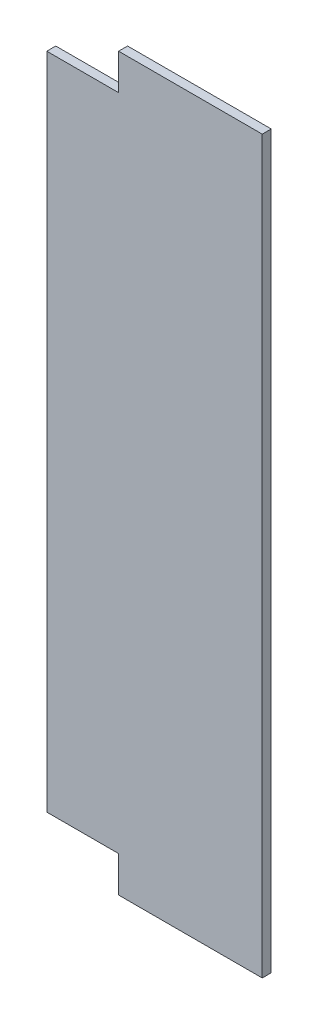
ISO-10303-21;
HEADER;
FILE_DESCRIPTION(('STEP AP214'),'2;1');
FILE_NAME('part.step','',(''),(''),'','','');
FILE_SCHEMA(('AUTOMOTIVE_DESIGN { 1 0 10303 214 1 1 1 1 }'));
ENDSEC;
DATA;
#1=APPLICATION_CONTEXT('core data for automotive mechanical design processes');
#2=APPLICATION_PROTOCOL_DEFINITION('international standard','automotive_design',2000,#1);
#3=PRODUCT_CONTEXT('',#1,'mechanical');
#4=PRODUCT('Part','Part','',(#3));
#5=PRODUCT_RELATED_PRODUCT_CATEGORY('part','',(#4));
#6=PRODUCT_DEFINITION_FORMATION('','',#4);
#7=PRODUCT_DEFINITION_CONTEXT('part definition',#1,'design');
#8=PRODUCT_DEFINITION('design','',#6,#7);
#9=PRODUCT_DEFINITION_SHAPE('','',#8);
#10=(LENGTH_UNIT() NAMED_UNIT(*) SI_UNIT(.MILLI.,.METRE.));
#11=(NAMED_UNIT(*) PLANE_ANGLE_UNIT() SI_UNIT($,.RADIAN.));
#12=(NAMED_UNIT(*) SI_UNIT($,.STERADIAN.) SOLID_ANGLE_UNIT());
#13=UNCERTAINTY_MEASURE_WITH_UNIT(LENGTH_MEASURE(1.E-05),#10,'distance_accuracy_value','');
#14=(GEOMETRIC_REPRESENTATION_CONTEXT(3) GLOBAL_UNCERTAINTY_ASSIGNED_CONTEXT((#13)) GLOBAL_UNIT_ASSIGNED_CONTEXT((#10,
#11,#12)) REPRESENTATION_CONTEXT('',''));
#15=CARTESIAN_POINT('',(0.,0.,0.));
#16=DIRECTION('',(0.,0.,1.));
#17=DIRECTION('',(1.,0.,0.));
#18=AXIS2_PLACEMENT_3D('',#15,#16,#17);
#19=CARTESIAN_POINT('',(76.2,129.2225,1.5875));
#20=DIRECTION('',(-1.,0.,0.));
#21=DIRECTION('',(0.,0.,1.));
#22=AXIS2_PLACEMENT_3D('',#19,#20,#21);
#23=PLANE('',#22);
#24=DIRECTION('',(0.,1.,0.));
#25=VECTOR('',#24,1.);
#26=CARTESIAN_POINT('',(76.2,129.2225,-1.5875));
#27=LINE('',#26,#25);
#28=CARTESIAN_POINT('',(76.2,-129.2225,-1.5875));
#29=VERTEX_POINT('',#28);
#30=CARTESIAN_POINT('',(76.2,129.2225,-1.5875));
#31=VERTEX_POINT('',#30);
#32=EDGE_CURVE('E148',#29,#31,#27,.T.);
#33=ORIENTED_EDGE('',*,*,#32,.T.);
#34=DIRECTION('',(0.,0.,-1.));
#35=VECTOR('',#34,1.);
#36=CARTESIAN_POINT('',(76.2,129.2225,1.5875));
#37=LINE('',#36,#35);
#38=CARTESIAN_POINT('',(76.2,129.2225,1.5875));
#39=VERTEX_POINT('',#38);
#40=EDGE_CURVE('E11',#39,#31,#37,.T.);
#41=ORIENTED_EDGE('',*,*,#40,.F.);
#42=DIRECTION('',(0.,1.,0.));
#43=VECTOR('',#42,1.);
#44=CARTESIAN_POINT('',(76.2,129.2225,1.5875));
#45=LINE('',#44,#43);
#46=CARTESIAN_POINT('',(76.2,-129.2225,1.5875));
#47=VERTEX_POINT('',#46);
#48=EDGE_CURVE('E170',#47,#39,#45,.T.);
#49=ORIENTED_EDGE('',*,*,#48,.F.);
#50=DIRECTION('',(0.,0.,-1.));
#51=VECTOR('',#50,1.);
#52=CARTESIAN_POINT('',(76.2,-129.2225,1.5875));
#53=LINE('',#52,#51);
#54=EDGE_CURVE('E144',#47,#29,#53,.T.);
#55=ORIENTED_EDGE('',*,*,#54,.T.);
#56=EDGE_LOOP('',(#33,#41,#49,#55));
#57=FACE_BOUND('',#56,.T.);
#58=ADVANCED_FACE('F47',(#57),#23,.F.);
#59=CARTESIAN_POINT('',(25.4,129.2225,1.5875));
#60=DIRECTION('',(0.,-1.,0.));
#61=DIRECTION('',(0.,0.,-1.));
#62=AXIS2_PLACEMENT_3D('',#59,#60,#61);
#63=PLANE('',#62);
#64=DIRECTION('',(-1.,0.,0.));
#65=VECTOR('',#64,1.);
#66=CARTESIAN_POINT('',(25.4,129.2225,-1.5875));
#67=LINE('',#66,#65);
#68=CARTESIAN_POINT('',(25.4,129.2225,-1.5875));
#69=VERTEX_POINT('',#68);
#70=EDGE_CURVE('E152',#31,#69,#67,.T.);
#71=ORIENTED_EDGE('',*,*,#70,.T.);
#72=DIRECTION('',(0.,0.,-1.));
#73=VECTOR('',#72,1.);
#74=CARTESIAN_POINT('',(25.4,129.2225,1.5875));
#75=LINE('',#74,#73);
#76=CARTESIAN_POINT('',(25.4,129.2225,1.5875));
#77=VERTEX_POINT('',#76);
#78=EDGE_CURVE('E56',#77,#69,#75,.T.);
#79=ORIENTED_EDGE('',*,*,#78,.F.);
#80=DIRECTION('',(-1.,0.,0.));
#81=VECTOR('',#80,1.);
#82=CARTESIAN_POINT('',(25.4,129.2225,1.5875));
#83=LINE('',#82,#81);
#84=EDGE_CURVE('E107',#39,#77,#83,.T.);
#85=ORIENTED_EDGE('',*,*,#84,.F.);
#86=ORIENTED_EDGE('',*,*,#40,.T.);
#87=EDGE_LOOP('',(#71,#79,#85,#86));
#88=FACE_BOUND('',#87,.T.);
#89=ADVANCED_FACE('F216',(#88),#63,.F.);
#90=CARTESIAN_POINT('',(25.4,129.2225,1.5875));
#91=DIRECTION('',(1.,0.,0.));
#92=DIRECTION('',(0.,1.,0.));
#93=AXIS2_PLACEMENT_3D('',#90,#91,#92);
#94=PLANE('',#93);
#95=DIRECTION('',(0.,-1.,0.));
#96=VECTOR('',#95,1.);
#97=CARTESIAN_POINT('',(25.4,129.2225,-1.5875));
#98=LINE('',#97,#96);
#99=CARTESIAN_POINT('',(25.4,116.5225,-1.5875));
#100=VERTEX_POINT('',#99);
#101=EDGE_CURVE('E155',#69,#100,#98,.T.);
#102=ORIENTED_EDGE('',*,*,#101,.T.);
#103=DIRECTION('',(0.,0.,-1.));
#104=VECTOR('',#103,1.);
#105=CARTESIAN_POINT('',(25.4,116.5225,1.5875));
#106=LINE('',#105,#104);
#107=CARTESIAN_POINT('',(25.4,116.5225,1.5875));
#108=VERTEX_POINT('',#107);
#109=EDGE_CURVE('E181',#108,#100,#106,.T.);
#110=ORIENTED_EDGE('',*,*,#109,.F.);
#111=DIRECTION('',(0.,-1.,0.));
#112=VECTOR('',#111,1.);
#113=CARTESIAN_POINT('',(25.4,129.2225,1.5875));
#114=LINE('',#113,#112);
#115=EDGE_CURVE('E191',#77,#108,#114,.T.);
#116=ORIENTED_EDGE('',*,*,#115,.F.);
#117=ORIENTED_EDGE('',*,*,#78,.T.);
#118=EDGE_LOOP('',(#102,#110,#116,#117));
#119=FACE_BOUND('',#118,.T.);
#120=ADVANCED_FACE('F189',(#119),#94,.F.);
#121=CARTESIAN_POINT('',(0.,116.5225,1.5875));
#122=DIRECTION('',(0.,-1.,0.));
#123=DIRECTION('',(0.,0.,-1.));
#124=AXIS2_PLACEMENT_3D('',#121,#122,#123);
#125=PLANE('',#124);
#126=DIRECTION('',(-1.,0.,0.));
#127=VECTOR('',#126,1.);
#128=CARTESIAN_POINT('',(0.,116.5225,-1.5875));
#129=LINE('',#128,#127);
#130=CARTESIAN_POINT('',(0.,116.5225,-1.5875));
#131=VERTEX_POINT('',#130);
#132=EDGE_CURVE('E158',#100,#131,#129,.T.);
#133=ORIENTED_EDGE('',*,*,#132,.T.);
#134=DIRECTION('',(0.,0.,-1.));
#135=VECTOR('',#134,1.);
#136=CARTESIAN_POINT('',(0.,116.5225,1.5875));
#137=LINE('',#136,#135);
#138=CARTESIAN_POINT('',(0.,116.5225,1.5875));
#139=VERTEX_POINT('',#138);
#140=EDGE_CURVE('E177',#139,#131,#137,.T.);
#141=ORIENTED_EDGE('',*,*,#140,.F.);
#142=DIRECTION('',(-1.,0.,0.));
#143=VECTOR('',#142,1.);
#144=CARTESIAN_POINT('',(0.,116.5225,1.5875));
#145=LINE('',#144,#143);
#146=EDGE_CURVE('E204',#108,#139,#145,.T.);
#147=ORIENTED_EDGE('',*,*,#146,.F.);
#148=ORIENTED_EDGE('',*,*,#109,.T.);
#149=EDGE_LOOP('',(#133,#141,#147,#148));
#150=FACE_BOUND('',#149,.T.);
#151=ADVANCED_FACE('F199',(#150),#125,.F.);
#152=CARTESIAN_POINT('',(0.,116.5225,1.5875));
#153=DIRECTION('',(1.,0.,0.));
#154=DIRECTION('',(0.,0.,-1.));
#155=AXIS2_PLACEMENT_3D('',#152,#153,#154);
#156=PLANE('',#155);
#157=DIRECTION('',(0.,-1.,0.));
#158=VECTOR('',#157,1.);
#159=CARTESIAN_POINT('',(0.,116.5225,-1.5875));
#160=LINE('',#159,#158);
#161=CARTESIAN_POINT('',(0.,-116.5225,-1.5875));
#162=VERTEX_POINT('',#161);
#163=EDGE_CURVE('E161',#131,#162,#160,.T.);
#164=ORIENTED_EDGE('',*,*,#163,.T.);
#165=DIRECTION('',(0.,0.,-1.));
#166=VECTOR('',#165,1.);
#167=CARTESIAN_POINT('',(0.,-116.5225,1.5875));
#168=LINE('',#167,#166);
#169=CARTESIAN_POINT('',(0.,-116.5225,1.5875));
#170=VERTEX_POINT('',#169);
#171=EDGE_CURVE('E137',#170,#162,#168,.T.);
#172=ORIENTED_EDGE('',*,*,#171,.F.);
#173=DIRECTION('',(0.,-1.,0.));
#174=VECTOR('',#173,1.);
#175=CARTESIAN_POINT('',(0.,116.5225,1.5875));
#176=LINE('',#175,#174);
#177=EDGE_CURVE('E126',#139,#170,#176,.T.);
#178=ORIENTED_EDGE('',*,*,#177,.F.);
#179=ORIENTED_EDGE('',*,*,#140,.T.);
#180=EDGE_LOOP('',(#164,#172,#178,#179));
#181=FACE_BOUND('',#180,.T.);
#182=ADVANCED_FACE('F202',(#181),#156,.F.);
#183=CARTESIAN_POINT('',(0.,-116.5225,1.5875));
#184=DIRECTION('',(0.,1.,0.));
#185=DIRECTION('',(0.,0.,1.));
#186=AXIS2_PLACEMENT_3D('',#183,#184,#185);
#187=PLANE('',#186);
#188=DIRECTION('',(1.,0.,0.));
#189=VECTOR('',#188,1.);
#190=CARTESIAN_POINT('',(0.,-116.5225,-1.5875));
#191=LINE('',#190,#189);
#192=CARTESIAN_POINT('',(25.4,-116.5225,-1.5875));
#193=VERTEX_POINT('',#192);
#194=EDGE_CURVE('E135',#162,#193,#191,.T.);
#195=ORIENTED_EDGE('',*,*,#194,.T.);
#196=DIRECTION('',(0.,0.,-1.));
#197=VECTOR('',#196,1.);
#198=CARTESIAN_POINT('',(25.4,-116.5225,1.5875));
#199=LINE('',#198,#197);
#200=CARTESIAN_POINT('',(25.4,-116.5225,1.5875));
#201=VERTEX_POINT('',#200);
#202=EDGE_CURVE('E132',#201,#193,#199,.T.);
#203=ORIENTED_EDGE('',*,*,#202,.F.);
#204=DIRECTION('',(1.,0.,0.));
#205=VECTOR('',#204,1.);
#206=CARTESIAN_POINT('',(0.,-116.5225,1.5875));
#207=LINE('',#206,#205);
#208=EDGE_CURVE('E120',#170,#201,#207,.T.);
#209=ORIENTED_EDGE('',*,*,#208,.F.);
#210=ORIENTED_EDGE('',*,*,#171,.T.);
#211=EDGE_LOOP('',(#195,#203,#209,#210));
#212=FACE_BOUND('',#211,.T.);
#213=ADVANCED_FACE('F133',(#212),#187,.F.);
#214=CARTESIAN_POINT('',(25.4,-129.2225,1.5875));
#215=DIRECTION('',(1.,0.,0.));
#216=DIRECTION('',(0.,1.,0.));
#217=AXIS2_PLACEMENT_3D('',#214,#215,#216);
#218=PLANE('',#217);
#219=DIRECTION('',(0.,-1.,0.));
#220=VECTOR('',#219,1.);
#221=CARTESIAN_POINT('',(25.4,-129.2225,-1.5875));
#222=LINE('',#221,#220);
#223=CARTESIAN_POINT('',(25.4,-129.2225,-1.5875));
#224=VERTEX_POINT('',#223);
#225=EDGE_CURVE('E93',#193,#224,#222,.T.);
#226=ORIENTED_EDGE('',*,*,#225,.T.);
#227=DIRECTION('',(0.,0.,-1.));
#228=VECTOR('',#227,1.);
#229=CARTESIAN_POINT('',(25.4,-129.2225,1.5875));
#230=LINE('',#229,#228);
#231=CARTESIAN_POINT('',(25.4,-129.2225,1.5875));
#232=VERTEX_POINT('',#231);
#233=EDGE_CURVE('E138',#232,#224,#230,.T.);
#234=ORIENTED_EDGE('',*,*,#233,.F.);
#235=DIRECTION('',(0.,-1.,0.));
#236=VECTOR('',#235,1.);
#237=CARTESIAN_POINT('',(25.4,-129.2225,1.5875));
#238=LINE('',#237,#236);
#239=EDGE_CURVE('E124',#201,#232,#238,.T.);
#240=ORIENTED_EDGE('',*,*,#239,.F.);
#241=ORIENTED_EDGE('',*,*,#202,.T.);
#242=EDGE_LOOP('',(#226,#234,#240,#241));
#243=FACE_BOUND('',#242,.T.);
#244=ADVANCED_FACE('F140',(#243),#218,.F.);
#245=CARTESIAN_POINT('',(25.4,-129.2225,1.5875));
#246=DIRECTION('',(0.,1.,0.));
#247=DIRECTION('',(0.,0.,1.));
#248=AXIS2_PLACEMENT_3D('',#245,#246,#247);
#249=PLANE('',#248);
#250=DIRECTION('',(1.,0.,0.));
#251=VECTOR('',#250,1.);
#252=CARTESIAN_POINT('',(25.4,-129.2225,-1.5875));
#253=LINE('',#252,#251);
#254=EDGE_CURVE('E99',#224,#29,#253,.T.);
#255=ORIENTED_EDGE('',*,*,#254,.T.);
#256=ORIENTED_EDGE('',*,*,#54,.F.);
#257=DIRECTION('',(1.,0.,0.));
#258=VECTOR('',#257,1.);
#259=CARTESIAN_POINT('',(25.4,-129.2225,1.5875));
#260=LINE('',#259,#258);
#261=EDGE_CURVE('E64',#232,#47,#260,.T.);
#262=ORIENTED_EDGE('',*,*,#261,.F.);
#263=ORIENTED_EDGE('',*,*,#233,.T.);
#264=EDGE_LOOP('',(#255,#256,#262,#263));
#265=FACE_BOUND('',#264,.T.);
#266=ADVANCED_FACE('F232',(#265),#249,.F.);
#267=CARTESIAN_POINT('',(0.,0.,1.5875));
#268=DIRECTION('',(0.,0.,1.));
#269=DIRECTION('',(1.,0.,0.));
#270=AXIS2_PLACEMENT_3D('',#267,#268,#269);
#271=PLANE('',#270);
#272=ORIENTED_EDGE('',*,*,#48,.T.);
#273=ORIENTED_EDGE('',*,*,#84,.T.);
#274=ORIENTED_EDGE('',*,*,#115,.T.);
#275=ORIENTED_EDGE('',*,*,#146,.T.);
#276=ORIENTED_EDGE('',*,*,#177,.T.);
#277=ORIENTED_EDGE('',*,*,#208,.T.);
#278=ORIENTED_EDGE('',*,*,#239,.T.);
#279=ORIENTED_EDGE('',*,*,#261,.T.);
#280=EDGE_LOOP('',(#272,#273,#274,#275,#276,#277,#278,#279));
#281=FACE_BOUND('',#280,.T.);
#282=ADVANCED_FACE('F122',(#281),#271,.T.);
#283=CARTESIAN_POINT('',(0.,0.,-1.5875));
#284=DIRECTION('',(0.,0.,1.));
#285=DIRECTION('',(1.,0.,0.));
#286=AXIS2_PLACEMENT_3D('',#283,#284,#285);
#287=PLANE('',#286);
#288=ORIENTED_EDGE('',*,*,#32,.F.);
#289=ORIENTED_EDGE('',*,*,#254,.F.);
#290=ORIENTED_EDGE('',*,*,#225,.F.);
#291=ORIENTED_EDGE('',*,*,#194,.F.);
#292=ORIENTED_EDGE('',*,*,#163,.F.);
#293=ORIENTED_EDGE('',*,*,#132,.F.);
#294=ORIENTED_EDGE('',*,*,#101,.F.);
#295=ORIENTED_EDGE('',*,*,#70,.F.);
#296=EDGE_LOOP('',(#288,#289,#290,#291,#292,#293,#294,#295));
#297=FACE_BOUND('',#296,.T.);
#298=ADVANCED_FACE('F195',(#297),#287,.F.);
#299=CLOSED_SHELL('',(#58,#89,#120,#151,#182,#213,#244,#266,#282,#298));
#300=MANIFOLD_SOLID_BREP('B2',#299);
#301=ADVANCED_BREP_SHAPE_REPRESENTATION('',(#18,#300),#14);
#302=SHAPE_DEFINITION_REPRESENTATION(#9,#301);
ENDSEC;
END-ISO-10303-21;
